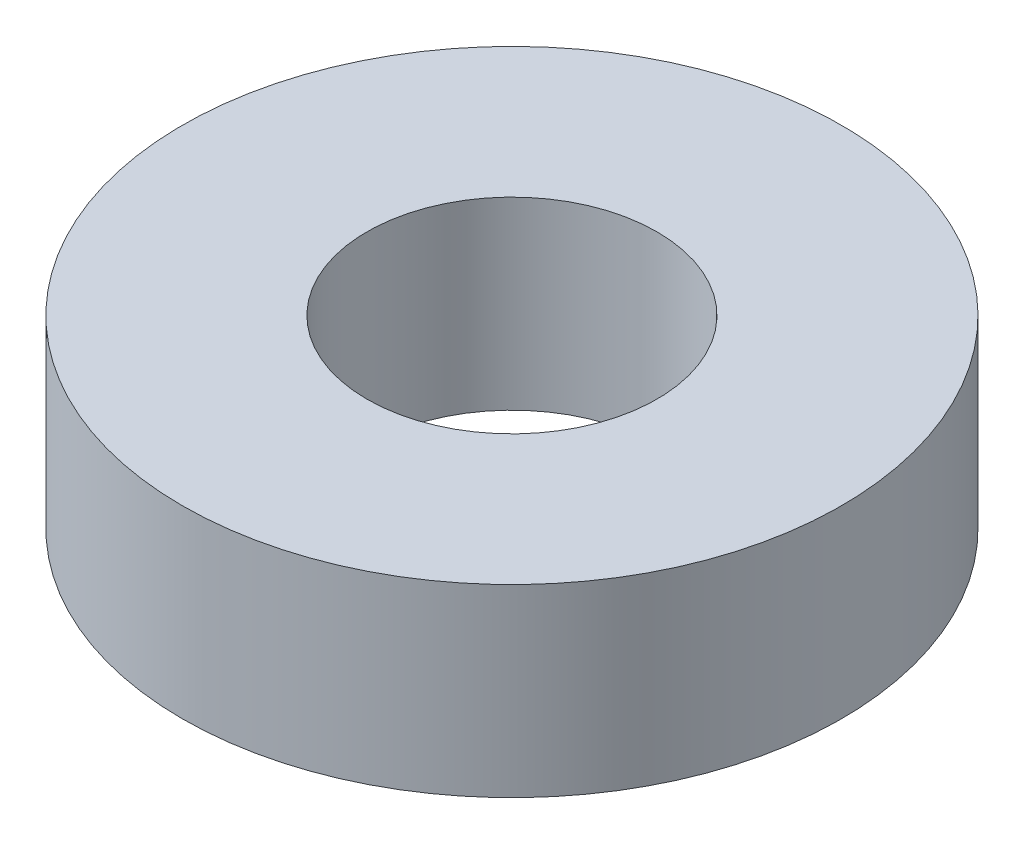
ISO-10303-21;
HEADER;
FILE_DESCRIPTION(('STEP AP214'),'2;1');
FILE_NAME('part.step','',(''),(''),'','','');
FILE_SCHEMA(('AUTOMOTIVE_DESIGN { 1 0 10303 214 1 1 1 1 }'));
ENDSEC;
DATA;
#1=APPLICATION_CONTEXT('core data for automotive mechanical design processes');
#2=APPLICATION_PROTOCOL_DEFINITION('international standard','automotive_design',2000,#1);
#3=PRODUCT_CONTEXT('',#1,'mechanical');
#4=PRODUCT('Part','Part','',(#3));
#5=PRODUCT_RELATED_PRODUCT_CATEGORY('part','',(#4));
#6=PRODUCT_DEFINITION_FORMATION('','',#4);
#7=PRODUCT_DEFINITION_CONTEXT('part definition',#1,'design');
#8=PRODUCT_DEFINITION('design','',#6,#7);
#9=PRODUCT_DEFINITION_SHAPE('','',#8);
#10=(LENGTH_UNIT() NAMED_UNIT(*) SI_UNIT(.MILLI.,.METRE.));
#11=(NAMED_UNIT(*) PLANE_ANGLE_UNIT() SI_UNIT($,.RADIAN.));
#12=(NAMED_UNIT(*) SI_UNIT($,.STERADIAN.) SOLID_ANGLE_UNIT());
#13=UNCERTAINTY_MEASURE_WITH_UNIT(LENGTH_MEASURE(1.E-05),#10,'distance_accuracy_value','');
#14=(GEOMETRIC_REPRESENTATION_CONTEXT(3) GLOBAL_UNCERTAINTY_ASSIGNED_CONTEXT((#13)) GLOBAL_UNIT_ASSIGNED_CONTEXT((#10,
#11,#12)) REPRESENTATION_CONTEXT('',''));
#15=CARTESIAN_POINT('',(0.,0.,0.));
#16=DIRECTION('',(0.,0.,1.));
#17=DIRECTION('',(1.,0.,0.));
#18=AXIS2_PLACEMENT_3D('',#15,#16,#17);
#19=CARTESIAN_POINT('',(0.,28.,0.));
#20=DIRECTION('',(0.,1.,0.));
#21=DIRECTION('',(0.,0.,1.));
#22=AXIS2_PLACEMENT_3D('',#19,#20,#21);
#23=PLANE('',#22);
#24=CARTESIAN_POINT('',(0.,28.,0.));
#25=DIRECTION('',(0.,1.,0.));
#26=DIRECTION('',(0.,0.,1.));
#27=AXIS2_PLACEMENT_3D('',#24,#25,#26);
#28=CIRCLE('',#27,50.);
#29=CARTESIAN_POINT('',(0.,28.,50.));
#30=VERTEX_POINT('',#29);
#31=EDGE_CURVE('E10',#30,#30,#28,.T.);
#32=ORIENTED_EDGE('',*,*,#31,.T.);
#33=EDGE_LOOP('',(#32));
#34=FACE_BOUND('',#33,.T.);
#35=CARTESIAN_POINT('',(0.,28.,0.));
#36=DIRECTION('',(0.,1.,0.));
#37=DIRECTION('',(0.,0.,1.));
#38=AXIS2_PLACEMENT_3D('',#35,#36,#37);
#39=CIRCLE('',#38,22.);
#40=CARTESIAN_POINT('',(0.,28.,22.));
#41=VERTEX_POINT('',#40);
#42=EDGE_CURVE('E49',#41,#41,#39,.T.);
#43=ORIENTED_EDGE('',*,*,#42,.F.);
#44=EDGE_LOOP('',(#43));
#45=FACE_BOUND('',#44,.T.);
#46=ADVANCED_FACE('F36',(#34,#45),#23,.T.);
#47=CARTESIAN_POINT('',(0.,0.,0.));
#48=DIRECTION('',(0.,1.,0.));
#49=DIRECTION('',(0.,0.,1.));
#50=AXIS2_PLACEMENT_3D('',#47,#48,#49);
#51=PLANE('',#50);
#52=CARTESIAN_POINT('',(0.,0.,0.));
#53=DIRECTION('',(0.,1.,0.));
#54=DIRECTION('',(0.,0.,1.));
#55=AXIS2_PLACEMENT_3D('',#52,#53,#54);
#56=CIRCLE('',#55,50.);
#57=CARTESIAN_POINT('',(0.,0.,50.));
#58=VERTEX_POINT('',#57);
#59=EDGE_CURVE('E40',#58,#58,#56,.T.);
#60=ORIENTED_EDGE('',*,*,#59,.F.);
#61=EDGE_LOOP('',(#60));
#62=FACE_BOUND('',#61,.T.);
#63=CARTESIAN_POINT('',(0.,0.,0.));
#64=DIRECTION('',(0.,1.,0.));
#65=DIRECTION('',(0.,0.,1.));
#66=AXIS2_PLACEMENT_3D('',#63,#64,#65);
#67=CIRCLE('',#66,22.);
#68=CARTESIAN_POINT('',(0.,0.,22.));
#69=VERTEX_POINT('',#68);
#70=EDGE_CURVE('E51',#69,#69,#67,.T.);
#71=ORIENTED_EDGE('',*,*,#70,.T.);
#72=EDGE_LOOP('',(#71));
#73=FACE_BOUND('',#72,.T.);
#74=ADVANCED_FACE('F63',(#62,#73),#51,.F.);
#75=CARTESIAN_POINT('',(0.,28.,0.));
#76=DIRECTION('',(0.,-1.,0.));
#77=DIRECTION('',(0.,0.,-1.));
#78=AXIS2_PLACEMENT_3D('',#75,#76,#77);
#79=CYLINDRICAL_SURFACE('',#78,50.);
#80=ORIENTED_EDGE('',*,*,#31,.F.);
#81=EDGE_LOOP('',(#80));
#82=FACE_BOUND('',#81,.T.);
#83=ORIENTED_EDGE('',*,*,#59,.T.);
#84=EDGE_LOOP('',(#83));
#85=FACE_BOUND('',#84,.T.);
#86=ADVANCED_FACE('F38',(#82,#85),#79,.T.);
#87=CARTESIAN_POINT('',(0.,28.,0.));
#88=DIRECTION('',(0.,-1.,0.));
#89=DIRECTION('',(0.,0.,-1.));
#90=AXIS2_PLACEMENT_3D('',#87,#88,#89);
#91=CYLINDRICAL_SURFACE('',#90,22.);
#92=ORIENTED_EDGE('',*,*,#42,.T.);
#93=EDGE_LOOP('',(#92));
#94=FACE_BOUND('',#93,.T.);
#95=ORIENTED_EDGE('',*,*,#70,.F.);
#96=EDGE_LOOP('',(#95));
#97=FACE_BOUND('',#96,.T.);
#98=ADVANCED_FACE('F59',(#94,#97),#91,.F.);
#99=CLOSED_SHELL('',(#46,#74,#86,#98));
#100=MANIFOLD_SOLID_BREP('B2',#99);
#101=ADVANCED_BREP_SHAPE_REPRESENTATION('',(#18,#100),#14);
#102=SHAPE_DEFINITION_REPRESENTATION(#9,#101);
ENDSEC;
END-ISO-10303-21;
